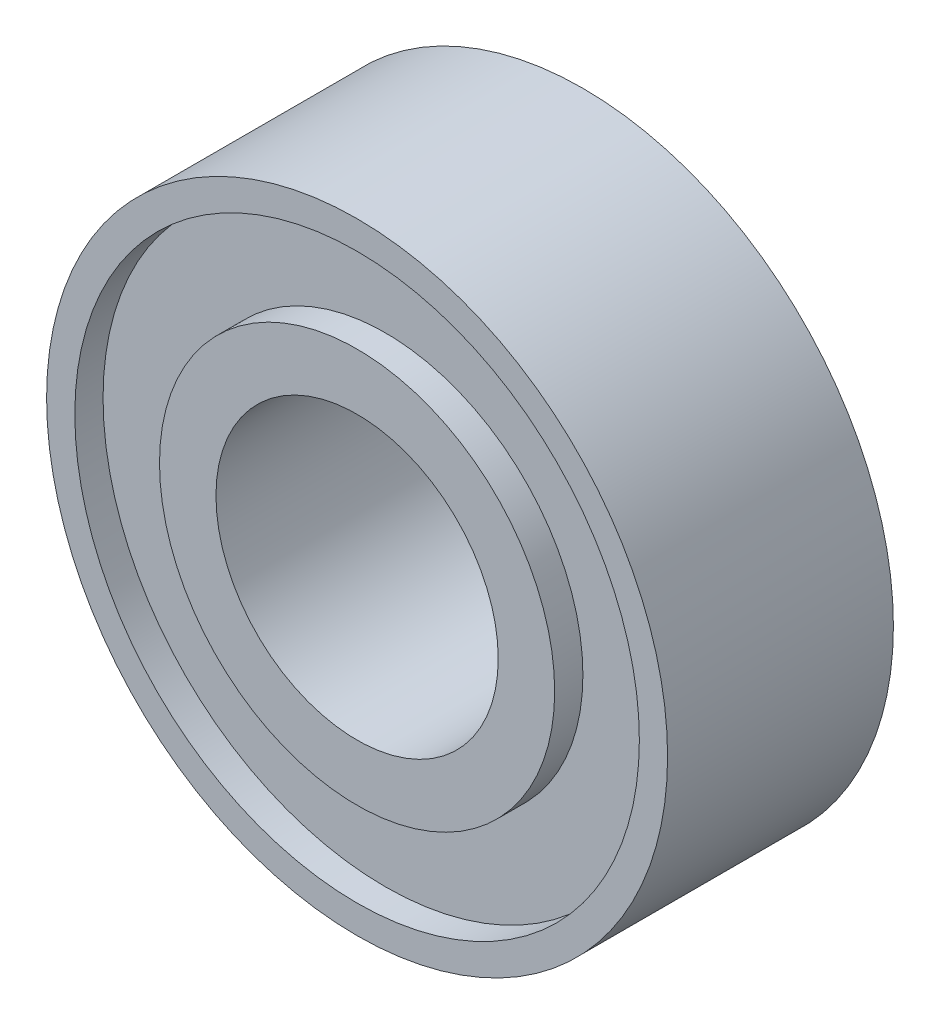
ISO-10303-21;
HEADER;
FILE_DESCRIPTION(('STEP AP214'),'2;1');
FILE_NAME('part.step','',(''),(''),'','','');
FILE_SCHEMA(('AUTOMOTIVE_DESIGN { 1 0 10303 214 1 1 1 1 }'));
ENDSEC;
DATA;
#1=APPLICATION_CONTEXT('core data for automotive mechanical design processes');
#2=APPLICATION_PROTOCOL_DEFINITION('international standard','automotive_design',2000,#1);
#3=PRODUCT_CONTEXT('',#1,'mechanical');
#4=PRODUCT('Part','Part','',(#3));
#5=PRODUCT_RELATED_PRODUCT_CATEGORY('part','',(#4));
#6=PRODUCT_DEFINITION_FORMATION('','',#4);
#7=PRODUCT_DEFINITION_CONTEXT('part definition',#1,'design');
#8=PRODUCT_DEFINITION('design','',#6,#7);
#9=PRODUCT_DEFINITION_SHAPE('','',#8);
#10=(LENGTH_UNIT() NAMED_UNIT(*) SI_UNIT(.MILLI.,.METRE.));
#11=(NAMED_UNIT(*) PLANE_ANGLE_UNIT() SI_UNIT($,.RADIAN.));
#12=(NAMED_UNIT(*) SI_UNIT($,.STERADIAN.) SOLID_ANGLE_UNIT());
#13=UNCERTAINTY_MEASURE_WITH_UNIT(LENGTH_MEASURE(1.E-05),#10,'distance_accuracy_value','');
#14=(GEOMETRIC_REPRESENTATION_CONTEXT(3) GLOBAL_UNCERTAINTY_ASSIGNED_CONTEXT((#13)) GLOBAL_UNIT_ASSIGNED_CONTEXT((#10,
#11,#12)) REPRESENTATION_CONTEXT('',''));
#15=CARTESIAN_POINT('',(0.,0.,0.));
#16=DIRECTION('',(0.,0.,1.));
#17=DIRECTION('',(1.,0.,0.));
#18=AXIS2_PLACEMENT_3D('',#15,#16,#17);
#19=CARTESIAN_POINT('',(5.72637126924888,6.63304672021329,-2.));
#20=DIRECTION('',(0.,0.,-1.));
#21=DIRECTION('',(1.,0.,0.));
#22=AXIS2_PLACEMENT_3D('',#19,#20,#21);
#23=PLANE('',#22);
#24=CARTESIAN_POINT('',(5.72637126924888,6.63304672021329,-2.));
#25=DIRECTION('',(0.,0.,1.));
#26=DIRECTION('',(1.,0.,0.));
#27=AXIS2_PLACEMENT_3D('',#24,#25,#26);
#28=CIRCLE('',#27,2.5);
#29=CARTESIAN_POINT('',(8.22637126924888,6.63304672021329,-2.));
#30=VERTEX_POINT('',#29);
#31=EDGE_CURVE('E73',#30,#30,#28,.T.);
#32=ORIENTED_EDGE('',*,*,#31,.T.);
#33=EDGE_LOOP('',(#32));
#34=FACE_BOUND('',#33,.T.);
#35=CARTESIAN_POINT('',(5.72637126924888,6.63304672021329,-2.));
#36=DIRECTION('',(0.,0.,1.));
#37=DIRECTION('',(1.,0.,0.));
#38=AXIS2_PLACEMENT_3D('',#35,#36,#37);
#39=CIRCLE('',#38,3.5);
#40=CARTESIAN_POINT('',(9.22637126924888,6.63304672021329,-2.));
#41=VERTEX_POINT('',#40);
#42=EDGE_CURVE('E86',#41,#41,#39,.T.);
#43=ORIENTED_EDGE('',*,*,#42,.F.);
#44=EDGE_LOOP('',(#43));
#45=FACE_BOUND('',#44,.T.);
#46=ADVANCED_FACE('F37',(#34,#45),#23,.T.);
#47=CARTESIAN_POINT('',(5.72637126924888,6.63304672021329,2.));
#48=DIRECTION('',(0.,0.,1.));
#49=DIRECTION('',(1.,0.,0.));
#50=AXIS2_PLACEMENT_3D('',#47,#48,#49);
#51=PLANE('',#50);
#52=CARTESIAN_POINT('',(5.72637126924888,6.63304672021329,2.));
#53=DIRECTION('',(0.,0.,1.));
#54=DIRECTION('',(1.,0.,0.));
#55=AXIS2_PLACEMENT_3D('',#52,#53,#54);
#56=CIRCLE('',#55,2.5);
#57=CARTESIAN_POINT('',(8.22637126924888,6.63304672021329,2.));
#58=VERTEX_POINT('',#57);
#59=EDGE_CURVE('E45',#58,#58,#56,.T.);
#60=ORIENTED_EDGE('',*,*,#59,.F.);
#61=EDGE_LOOP('',(#60));
#62=FACE_BOUND('',#61,.T.);
#63=CARTESIAN_POINT('',(5.72637126924888,6.63304672021329,2.));
#64=DIRECTION('',(0.,0.,1.));
#65=DIRECTION('',(1.,0.,0.));
#66=AXIS2_PLACEMENT_3D('',#63,#64,#65);
#67=CIRCLE('',#66,3.5);
#68=CARTESIAN_POINT('',(9.22637126924888,6.63304672021329,2.));
#69=VERTEX_POINT('',#68);
#70=EDGE_CURVE('E62',#69,#69,#67,.T.);
#71=ORIENTED_EDGE('',*,*,#70,.T.);
#72=EDGE_LOOP('',(#71));
#73=FACE_BOUND('',#72,.T.);
#74=ADVANCED_FACE('F104',(#62,#73),#51,.T.);
#75=CARTESIAN_POINT('',(5.72637126924888,6.63304672021329,2.));
#76=DIRECTION('',(0.,0.,1.));
#77=DIRECTION('',(1.,0.,0.));
#78=AXIS2_PLACEMENT_3D('',#75,#76,#77);
#79=CIRCLE('',#78,5.);
#80=CARTESIAN_POINT('',(10.7263712692489,6.63304672021329,2.));
#81=VERTEX_POINT('',#80);
#82=EDGE_CURVE('E55',#81,#81,#79,.T.);
#83=ORIENTED_EDGE('',*,*,#82,.F.);
#84=EDGE_LOOP('',(#83));
#85=FACE_BOUND('',#84,.T.);
#86=CARTESIAN_POINT('',(5.72637126924888,6.63304672021329,2.));
#87=DIRECTION('',(0.,0.,1.));
#88=DIRECTION('',(1.,0.,0.));
#89=AXIS2_PLACEMENT_3D('',#86,#87,#88);
#90=CIRCLE('',#89,5.5);
#91=CARTESIAN_POINT('',(11.2263712692489,6.63304672021329,2.));
#92=VERTEX_POINT('',#91);
#93=EDGE_CURVE('E10',#92,#92,#90,.T.);
#94=ORIENTED_EDGE('',*,*,#93,.T.);
#95=EDGE_LOOP('',(#94));
#96=FACE_BOUND('',#95,.T.);
#97=ADVANCED_FACE('F111',(#85,#96),#51,.T.);
#98=CARTESIAN_POINT('',(5.72637126924888,6.63304672021329,2.));
#99=DIRECTION('',(0.,0.,-1.));
#100=DIRECTION('',(-1.,0.,0.));
#101=AXIS2_PLACEMENT_3D('',#98,#99,#100);
#102=CYLINDRICAL_SURFACE('',#101,5.5);
#103=ORIENTED_EDGE('',*,*,#93,.F.);
#104=EDGE_LOOP('',(#103));
#105=FACE_BOUND('',#104,.T.);
#106=CARTESIAN_POINT('',(5.72637126924888,6.63304672021329,-2.));
#107=DIRECTION('',(0.,0.,1.));
#108=DIRECTION('',(1.,0.,0.));
#109=AXIS2_PLACEMENT_3D('',#106,#107,#108);
#110=CIRCLE('',#109,5.5);
#111=CARTESIAN_POINT('',(11.2263712692489,6.63304672021329,-2.));
#112=VERTEX_POINT('',#111);
#113=EDGE_CURVE('E66',#112,#112,#110,.T.);
#114=ORIENTED_EDGE('',*,*,#113,.T.);
#115=EDGE_LOOP('',(#114));
#116=FACE_BOUND('',#115,.T.);
#117=ADVANCED_FACE('F39',(#105,#116),#102,.T.);
#118=CARTESIAN_POINT('',(5.72637126924888,6.63304672021329,2.));
#119=DIRECTION('',(0.,0.,-1.));
#120=DIRECTION('',(-1.,0.,0.));
#121=AXIS2_PLACEMENT_3D('',#118,#119,#120);
#122=CYLINDRICAL_SURFACE('',#121,2.5);
#123=ORIENTED_EDGE('',*,*,#59,.T.);
#124=EDGE_LOOP('',(#123));
#125=FACE_BOUND('',#124,.T.);
#126=ORIENTED_EDGE('',*,*,#31,.F.);
#127=EDGE_LOOP('',(#126));
#128=FACE_BOUND('',#127,.T.);
#129=ADVANCED_FACE('F131',(#125,#128),#122,.F.);
#130=CARTESIAN_POINT('',(5.72637126924888,6.63304672021329,1.5));
#131=DIRECTION('',(0.,0.,1.));
#132=DIRECTION('',(1.,0.,0.));
#133=AXIS2_PLACEMENT_3D('',#130,#131,#132);
#134=CYLINDRICAL_SURFACE('',#133,5.);
#135=CARTESIAN_POINT('',(5.72637126924888,6.63304672021329,1.5));
#136=DIRECTION('',(0.,0.,1.));
#137=DIRECTION('',(1.,0.,0.));
#138=AXIS2_PLACEMENT_3D('',#135,#136,#137);
#139=CIRCLE('',#138,5.);
#140=CARTESIAN_POINT('',(10.7263712692489,6.63304672021329,1.5));
#141=VERTEX_POINT('',#140);
#142=EDGE_CURVE('E50',#141,#141,#139,.T.);
#143=ORIENTED_EDGE('',*,*,#142,.F.);
#144=EDGE_LOOP('',(#143));
#145=FACE_BOUND('',#144,.T.);
#146=ORIENTED_EDGE('',*,*,#82,.T.);
#147=EDGE_LOOP('',(#146));
#148=FACE_BOUND('',#147,.T.);
#149=ADVANCED_FACE('F137',(#145,#148),#134,.F.);
#150=CARTESIAN_POINT('',(5.72637126924888,6.63304672021329,1.5));
#151=DIRECTION('',(0.,0.,1.));
#152=DIRECTION('',(1.,0.,0.));
#153=AXIS2_PLACEMENT_3D('',#150,#151,#152);
#154=PLANE('',#153);
#155=CARTESIAN_POINT('',(5.72637126924888,6.63304672021329,1.5));
#156=DIRECTION('',(0.,0.,1.));
#157=DIRECTION('',(1.,0.,0.));
#158=AXIS2_PLACEMENT_3D('',#155,#156,#157);
#159=CIRCLE('',#158,3.5);
#160=CARTESIAN_POINT('',(9.22637126924888,6.63304672021329,1.5));
#161=VERTEX_POINT('',#160);
#162=EDGE_CURVE('E60',#161,#161,#159,.T.);
#163=ORIENTED_EDGE('',*,*,#162,.F.);
#164=EDGE_LOOP('',(#163));
#165=FACE_BOUND('',#164,.T.);
#166=ORIENTED_EDGE('',*,*,#142,.T.);
#167=EDGE_LOOP('',(#166));
#168=FACE_BOUND('',#167,.T.);
#169=ADVANCED_FACE('F124',(#165,#168),#154,.T.);
#170=CARTESIAN_POINT('',(5.72637126924888,6.63304672021329,1.5));
#171=DIRECTION('',(0.,0.,1.));
#172=DIRECTION('',(1.,0.,0.));
#173=AXIS2_PLACEMENT_3D('',#170,#171,#172);
#174=CYLINDRICAL_SURFACE('',#173,3.5);
#175=ORIENTED_EDGE('',*,*,#162,.T.);
#176=EDGE_LOOP('',(#175));
#177=FACE_BOUND('',#176,.T.);
#178=ORIENTED_EDGE('',*,*,#70,.F.);
#179=EDGE_LOOP('',(#178));
#180=FACE_BOUND('',#179,.T.);
#181=ADVANCED_FACE('F116',(#177,#180),#174,.T.);
#182=CARTESIAN_POINT('',(5.72637126924888,6.63304672021329,-2.));
#183=DIRECTION('',(0.,0.,1.));
#184=DIRECTION('',(1.,0.,0.));
#185=AXIS2_PLACEMENT_3D('',#182,#183,#184);
#186=CIRCLE('',#185,5.);
#187=CARTESIAN_POINT('',(10.7263712692489,6.63304672021329,-2.));
#188=VERTEX_POINT('',#187);
#189=EDGE_CURVE('E78',#188,#188,#186,.T.);
#190=ORIENTED_EDGE('',*,*,#189,.T.);
#191=EDGE_LOOP('',(#190));
#192=FACE_BOUND('',#191,.T.);
#193=ORIENTED_EDGE('',*,*,#113,.F.);
#194=EDGE_LOOP('',(#193));
#195=FACE_BOUND('',#194,.T.);
#196=ADVANCED_FACE('F107',(#192,#195),#23,.T.);
#197=CARTESIAN_POINT('',(5.72637126924888,6.63304672021329,-1.5));
#198=DIRECTION('',(0.,0.,-1.));
#199=DIRECTION('',(1.,0.,0.));
#200=AXIS2_PLACEMENT_3D('',#197,#198,#199);
#201=PLANE('',#200);
#202=CARTESIAN_POINT('',(5.72637126924888,6.63304672021329,-1.5));
#203=DIRECTION('',(0.,0.,1.));
#204=DIRECTION('',(1.,0.,0.));
#205=AXIS2_PLACEMENT_3D('',#202,#203,#204);
#206=CIRCLE('',#205,5.);
#207=CARTESIAN_POINT('',(10.7263712692489,6.63304672021329,-1.5));
#208=VERTEX_POINT('',#207);
#209=EDGE_CURVE('E77',#208,#208,#206,.T.);
#210=ORIENTED_EDGE('',*,*,#209,.F.);
#211=EDGE_LOOP('',(#210));
#212=FACE_BOUND('',#211,.T.);
#213=CARTESIAN_POINT('',(5.72637126924888,6.63304672021329,-1.5));
#214=DIRECTION('',(0.,0.,1.));
#215=DIRECTION('',(1.,0.,0.));
#216=AXIS2_PLACEMENT_3D('',#213,#214,#215);
#217=CIRCLE('',#216,3.5);
#218=CARTESIAN_POINT('',(9.22637126924888,6.63304672021329,-1.5));
#219=VERTEX_POINT('',#218);
#220=EDGE_CURVE('E82',#219,#219,#217,.T.);
#221=ORIENTED_EDGE('',*,*,#220,.T.);
#222=EDGE_LOOP('',(#221));
#223=FACE_BOUND('',#222,.T.);
#224=ADVANCED_FACE('F94',(#212,#223),#201,.T.);
#225=CARTESIAN_POINT('',(5.72637126924888,6.63304672021329,-1.5));
#226=DIRECTION('',(0.,0.,-1.));
#227=DIRECTION('',(-1.,0.,0.));
#228=AXIS2_PLACEMENT_3D('',#225,#226,#227);
#229=CYLINDRICAL_SURFACE('',#228,5.);
#230=ORIENTED_EDGE('',*,*,#209,.T.);
#231=EDGE_LOOP('',(#230));
#232=FACE_BOUND('',#231,.T.);
#233=ORIENTED_EDGE('',*,*,#189,.F.);
#234=EDGE_LOOP('',(#233));
#235=FACE_BOUND('',#234,.T.);
#236=ADVANCED_FACE('F99',(#232,#235),#229,.F.);
#237=CARTESIAN_POINT('',(5.72637126924888,6.63304672021329,-1.5));
#238=DIRECTION('',(0.,0.,-1.));
#239=DIRECTION('',(-1.,0.,0.));
#240=AXIS2_PLACEMENT_3D('',#237,#238,#239);
#241=CYLINDRICAL_SURFACE('',#240,3.5);
#242=ORIENTED_EDGE('',*,*,#220,.F.);
#243=EDGE_LOOP('',(#242));
#244=FACE_BOUND('',#243,.T.);
#245=ORIENTED_EDGE('',*,*,#42,.T.);
#246=EDGE_LOOP('',(#245));
#247=FACE_BOUND('',#246,.T.);
#248=ADVANCED_FACE('F96',(#244,#247),#241,.T.);
#249=CLOSED_SHELL('',(#46,#74,#97,#117,#129,#149,#169,#181,#196,#224,#236,#248));
#250=MANIFOLD_SOLID_BREP('B2',#249);
#251=ADVANCED_BREP_SHAPE_REPRESENTATION('',(#18,#250),#14);
#252=SHAPE_DEFINITION_REPRESENTATION(#9,#251);
ENDSEC;
END-ISO-10303-21;
